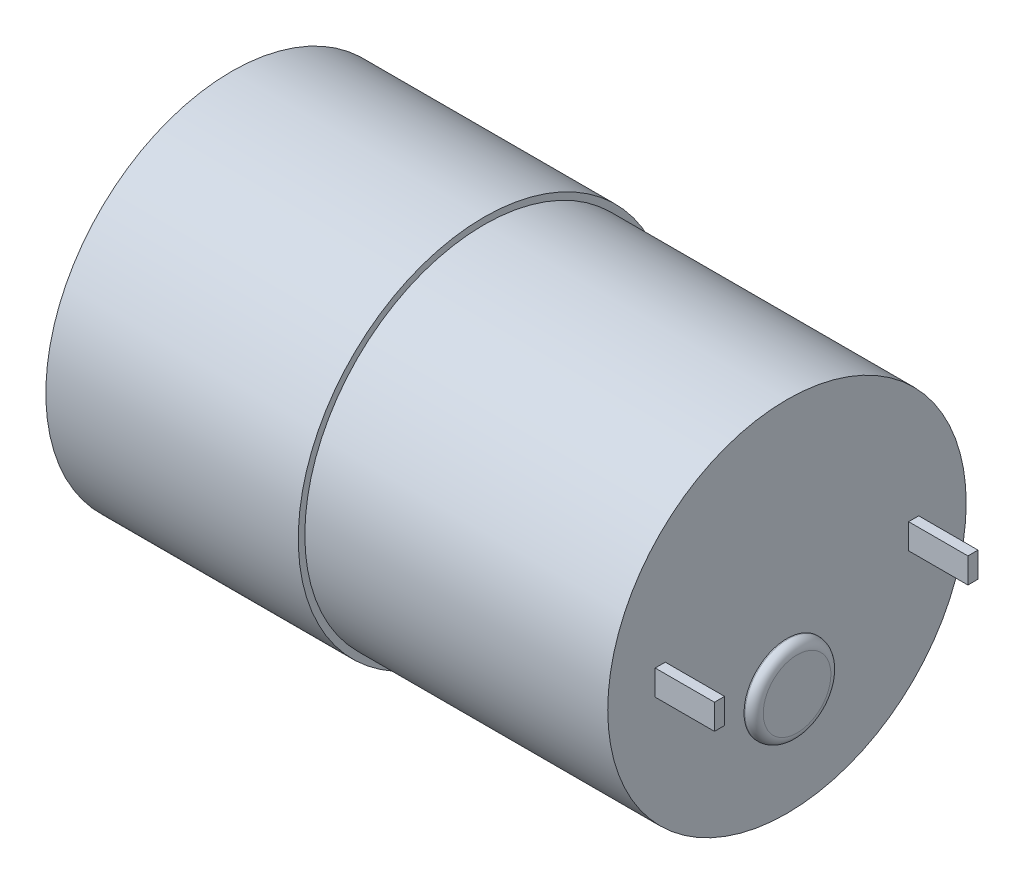
ISO-10303-21;
HEADER;
FILE_DESCRIPTION(('STEP AP214'),'2;1');
FILE_NAME('part.step','',(''),(''),'','','');
FILE_SCHEMA(('AUTOMOTIVE_DESIGN { 1 0 10303 214 1 1 1 1 }'));
ENDSEC;
DATA;
#1=APPLICATION_CONTEXT('core data for automotive mechanical design processes');
#2=APPLICATION_PROTOCOL_DEFINITION('international standard','automotive_design',2000,#1);
#3=PRODUCT_CONTEXT('',#1,'mechanical');
#4=PRODUCT('Part','Part','',(#3));
#5=PRODUCT_RELATED_PRODUCT_CATEGORY('part','',(#4));
#6=PRODUCT_DEFINITION_FORMATION('','',#4);
#7=PRODUCT_DEFINITION_CONTEXT('part definition',#1,'design');
#8=PRODUCT_DEFINITION('design','',#6,#7);
#9=PRODUCT_DEFINITION_SHAPE('','',#8);
#10=(LENGTH_UNIT() NAMED_UNIT(*) SI_UNIT(.MILLI.,.METRE.));
#11=(NAMED_UNIT(*) PLANE_ANGLE_UNIT() SI_UNIT($,.RADIAN.));
#12=(NAMED_UNIT(*) SI_UNIT($,.STERADIAN.) SOLID_ANGLE_UNIT());
#13=UNCERTAINTY_MEASURE_WITH_UNIT(LENGTH_MEASURE(1.E-05),#10,'distance_accuracy_value','');
#14=(GEOMETRIC_REPRESENTATION_CONTEXT(3) GLOBAL_UNCERTAINTY_ASSIGNED_CONTEXT((#13)) GLOBAL_UNIT_ASSIGNED_CONTEXT((#10,
#11,#12)) REPRESENTATION_CONTEXT('',''));
#15=CARTESIAN_POINT('',(0.,0.,0.));
#16=DIRECTION('',(0.,0.,1.));
#17=DIRECTION('',(1.,0.,0.));
#18=AXIS2_PLACEMENT_3D('',#15,#16,#17);
#19=CARTESIAN_POINT('',(-20.0340698562117,-7.,0.));
#20=DIRECTION('',(-1.,0.,0.));
#21=DIRECTION('',(0.,0.,1.));
#22=AXIS2_PLACEMENT_3D('',#19,#20,#21);
#23=CONICAL_SURFACE('',#22,0.,0.879418555966087);
#24=CARTESIAN_POINT('',(-25.,-7.,0.));
#25=DIRECTION('',(1.,0.,0.));
#26=DIRECTION('',(0.,0.,-1.));
#27=AXIS2_PLACEMENT_3D('',#24,#25,#26);
#28=CIRCLE('',#27,6.);
#29=CARTESIAN_POINT('',(-25.,-7.,-6.));
#30=VERTEX_POINT('',#29);
#31=EDGE_CURVE('E103',#30,#30,#28,.T.);
#32=ORIENTED_EDGE('',*,*,#31,.T.);
#33=EDGE_LOOP('',(#32));
#34=FACE_BOUND('',#33,.T.);
#35=CARTESIAN_POINT('',(-20.0340698562117,-7.,0.));
#36=VERTEX_POINT('',#35);
#37=VERTEX_LOOP('',#36);
#38=FACE_BOUND('',#37,.T.);
#39=ADVANCED_FACE('F62',(#34,#38),#23,.T.);
#40=CARTESIAN_POINT('',(30.1,-7.,0.));
#41=DIRECTION('',(1.,0.,0.));
#42=DIRECTION('',(0.,0.,-1.));
#43=AXIS2_PLACEMENT_3D('',#40,#41,#42);
#44=CYLINDRICAL_SURFACE('',#43,6.);
#45=CARTESIAN_POINT('',(-29.85,-7.,0.));
#46=DIRECTION('',(-1.,0.,0.));
#47=DIRECTION('',(0.,0.,1.));
#48=AXIS2_PLACEMENT_3D('',#45,#46,#47);
#49=CIRCLE('',#48,6.);
#50=CARTESIAN_POINT('',(-29.85,-7.,6.));
#51=VERTEX_POINT('',#50);
#52=EDGE_CURVE('E69',#51,#51,#49,.F.);
#53=ORIENTED_EDGE('',*,*,#52,.T.);
#54=EDGE_LOOP('',(#53));
#55=FACE_BOUND('',#54,.T.);
#56=ORIENTED_EDGE('',*,*,#31,.F.);
#57=EDGE_LOOP('',(#56));
#58=FACE_BOUND('',#57,.T.);
#59=ADVANCED_FACE('F73',(#55,#58),#44,.T.);
#60=CARTESIAN_POINT('',(-31.5,-1.,0.));
#61=DIRECTION('',(-1.,0.,0.));
#62=DIRECTION('',(0.,0.,1.));
#63=AXIS2_PLACEMENT_3D('',#60,#61,#62);
#64=PLANE('',#63);
#65=CARTESIAN_POINT('',(-31.5,-7.,0.));
#66=DIRECTION('',(-1.,0.,0.));
#67=DIRECTION('',(0.,0.,1.));
#68=AXIS2_PLACEMENT_3D('',#65,#66,#67);
#69=CIRCLE('',#68,4.34999999999999);
#70=CARTESIAN_POINT('',(-31.5,-7.,4.34999999999999));
#71=VERTEX_POINT('',#70);
#72=EDGE_CURVE('E14',#71,#71,#69,.T.);
#73=ORIENTED_EDGE('',*,*,#72,.T.);
#74=EDGE_LOOP('',(#73));
#75=FACE_BOUND('',#74,.T.);
#76=CARTESIAN_POINT('',(-31.5,-7.,0.));
#77=DIRECTION('',(1.,0.,0.));
#78=DIRECTION('',(0.,0.,-1.));
#79=AXIS2_PLACEMENT_3D('',#76,#77,#78);
#80=CIRCLE('',#79,3.);
#81=CARTESIAN_POINT('',(-31.5,-7.,-3.));
#82=VERTEX_POINT('',#81);
#83=EDGE_CURVE('E100',#82,#82,#80,.T.);
#84=ORIENTED_EDGE('',*,*,#83,.T.);
#85=EDGE_LOOP('',(#84));
#86=FACE_BOUND('',#85,.T.);
#87=ADVANCED_FACE('F78',(#75,#86),#64,.T.);
#88=CARTESIAN_POINT('',(30.1,-7.,0.));
#89=DIRECTION('',(1.,0.,0.));
#90=DIRECTION('',(0.,0.,-1.));
#91=AXIS2_PLACEMENT_3D('',#88,#89,#90);
#92=CYLINDRICAL_SURFACE('',#91,3.);
#93=CARTESIAN_POINT('',(-26.5,-7.,0.));
#94=DIRECTION('',(1.,0.,0.));
#95=DIRECTION('',(0.,0.,-1.));
#96=AXIS2_PLACEMENT_3D('',#93,#94,#95);
#97=CIRCLE('',#96,3.);
#98=CARTESIAN_POINT('',(-26.5,-7.,-3.));
#99=VERTEX_POINT('',#98);
#100=EDGE_CURVE('E99',#99,#99,#97,.T.);
#101=ORIENTED_EDGE('',*,*,#100,.T.);
#102=EDGE_LOOP('',(#101));
#103=FACE_BOUND('',#102,.T.);
#104=ORIENTED_EDGE('',*,*,#83,.F.);
#105=EDGE_LOOP('',(#104));
#106=FACE_BOUND('',#105,.T.);
#107=ADVANCED_FACE('F85',(#103,#106),#92,.F.);
#108=CARTESIAN_POINT('',(-26.5,-4.,0.));
#109=DIRECTION('',(-1.,0.,0.));
#110=DIRECTION('',(0.,0.,1.));
#111=AXIS2_PLACEMENT_3D('',#108,#109,#110);
#112=PLANE('',#111);
#113=ORIENTED_EDGE('',*,*,#100,.F.);
#114=EDGE_LOOP('',(#113));
#115=FACE_BOUND('',#114,.T.);
#116=ADVANCED_FACE('F89',(#115),#112,.T.);
#117=CARTESIAN_POINT('',(-29.85,-7.,0.));
#118=DIRECTION('',(1.,0.,0.));
#119=DIRECTION('',(0.,0.,-1.));
#120=AXIS2_PLACEMENT_3D('',#117,#118,#119);
#121=CONICAL_SURFACE('',#120,6.,0.78539816339745);
#122=ORIENTED_EDGE('',*,*,#72,.F.);
#123=EDGE_LOOP('',(#122));
#124=FACE_BOUND('',#123,.T.);
#125=ORIENTED_EDGE('',*,*,#52,.F.);
#126=EDGE_LOOP('',(#125));
#127=FACE_BOUND('',#126,.T.);
#128=ADVANCED_FACE('F64',(#124,#127),#121,.T.);
#129=CLOSED_SHELL('',(#39,#59,#87,#107,#116,#128));
#130=MANIFOLD_SOLID_BREP('B2',#129);
#131=CARTESIAN_POINT('',(30.,0.,0.));
#132=DIRECTION('',(-1.,0.,0.));
#133=DIRECTION('',(0.,-1.,0.));
#134=AXIS2_PLACEMENT_3D('',#131,#132,#133);
#135=PLANE('',#134);
#136=DIRECTION('',(0.,-1.,0.));
#137=VECTOR('',#136,1.);
#138=CARTESIAN_POINT('',(30.,1.25,-12.05));
#139=LINE('',#138,#137);
#140=CARTESIAN_POINT('',(30.,1.25,-12.05));
#141=VERTEX_POINT('',#140);
#142=CARTESIAN_POINT('',(30.,-1.25,-12.05));
#143=VERTEX_POINT('',#142);
#144=EDGE_CURVE('E292',#141,#143,#139,.T.);
#145=ORIENTED_EDGE('',*,*,#144,.F.);
#146=DIRECTION('',(0.,0.,1.));
#147=VECTOR('',#146,1.);
#148=CARTESIAN_POINT('',(30.,1.25,-12.05));
#149=LINE('',#148,#147);
#150=CARTESIAN_POINT('',(30.,1.25,-13.05));
#151=VERTEX_POINT('',#150);
#152=EDGE_CURVE('E305',#151,#141,#149,.T.);
#153=ORIENTED_EDGE('',*,*,#152,.F.);
#154=DIRECTION('',(0.,1.,0.));
#155=VECTOR('',#154,1.);
#156=CARTESIAN_POINT('',(30.,1.25,-13.05));
#157=LINE('',#156,#155);
#158=CARTESIAN_POINT('',(30.,-1.25,-13.05));
#159=VERTEX_POINT('',#158);
#160=EDGE_CURVE('E314',#159,#151,#157,.T.);
#161=ORIENTED_EDGE('',*,*,#160,.F.);
#162=DIRECTION('',(0.,0.,-1.));
#163=VECTOR('',#162,1.);
#164=CARTESIAN_POINT('',(30.,-1.25,-12.05));
#165=LINE('',#164,#163);
#166=EDGE_CURVE('E295',#143,#159,#165,.T.);
#167=ORIENTED_EDGE('',*,*,#166,.F.);
#168=EDGE_LOOP('',(#145,#153,#161,#167));
#169=FACE_BOUND('',#168,.T.);
#170=CARTESIAN_POINT('',(30.,-7.,0.));
#171=DIRECTION('',(-1.,0.,0.));
#172=DIRECTION('',(0.,-1.,0.));
#173=AXIS2_PLACEMENT_3D('',#170,#171,#172);
#174=CIRCLE('',#173,4.25);
#175=CARTESIAN_POINT('',(30.,-11.25,0.));
#176=VERTEX_POINT('',#175);
#177=EDGE_CURVE('E455',#176,#176,#174,.F.);
#178=ORIENTED_EDGE('',*,*,#177,.F.);
#179=EDGE_LOOP('',(#178));
#180=FACE_BOUND('',#179,.T.);
#181=CARTESIAN_POINT('',(30.,0.,0.));
#182=DIRECTION('',(-1.,0.,0.));
#183=DIRECTION('',(0.,-1.,0.));
#184=AXIS2_PLACEMENT_3D('',#181,#182,#183);
#185=CIRCLE('',#184,17.75);
#186=CARTESIAN_POINT('',(30.,-17.75,0.));
#187=VERTEX_POINT('',#186);
#188=EDGE_CURVE('E458',#187,#187,#185,.T.);
#189=ORIENTED_EDGE('',*,*,#188,.F.);
#190=EDGE_LOOP('',(#189));
#191=FACE_BOUND('',#190,.T.);
#192=DIRECTION('',(0.,-1.,0.));
#193=VECTOR('',#192,1.);
#194=CARTESIAN_POINT('',(30.,1.25,13.05));
#195=LINE('',#194,#193);
#196=CARTESIAN_POINT('',(30.,1.25,13.05));
#197=VERTEX_POINT('',#196);
#198=CARTESIAN_POINT('',(30.,-1.25,13.05));
#199=VERTEX_POINT('',#198);
#200=EDGE_CURVE('E291',#197,#199,#195,.T.);
#201=ORIENTED_EDGE('',*,*,#200,.F.);
#202=DIRECTION('',(0.,0.,1.));
#203=VECTOR('',#202,1.);
#204=CARTESIAN_POINT('',(30.,1.25,13.05));
#205=LINE('',#204,#203);
#206=CARTESIAN_POINT('',(30.,1.25,12.05));
#207=VERTEX_POINT('',#206);
#208=EDGE_CURVE('E288',#207,#197,#205,.T.);
#209=ORIENTED_EDGE('',*,*,#208,.F.);
#210=DIRECTION('',(0.,1.,0.));
#211=VECTOR('',#210,1.);
#212=CARTESIAN_POINT('',(30.,1.25,12.05));
#213=LINE('',#212,#211);
#214=CARTESIAN_POINT('',(30.,-1.25,12.05));
#215=VERTEX_POINT('',#214);
#216=EDGE_CURVE('E175',#215,#207,#213,.T.);
#217=ORIENTED_EDGE('',*,*,#216,.F.);
#218=DIRECTION('',(0.,0.,-1.));
#219=VECTOR('',#218,1.);
#220=CARTESIAN_POINT('',(30.,-1.25,13.05));
#221=LINE('',#220,#219);
#222=EDGE_CURVE('E170',#199,#215,#221,.T.);
#223=ORIENTED_EDGE('',*,*,#222,.F.);
#224=EDGE_LOOP('',(#201,#209,#217,#223));
#225=FACE_BOUND('',#224,.T.);
#226=ADVANCED_FACE('F155',(#169,#180,#191,#225),#135,.F.);
#227=CARTESIAN_POINT('',(-25.,18.4,0.));
#228=DIRECTION('',(1.,0.,0.));
#229=DIRECTION('',(0.,1.,0.));
#230=AXIS2_PLACEMENT_3D('',#227,#228,#229);
#231=PLANE('',#230);
#232=CARTESIAN_POINT('',(-25.,0.,-15.5));
#233=DIRECTION('',(-1.,0.,0.));
#234=DIRECTION('',(0.,0.,1.));
#235=AXIS2_PLACEMENT_3D('',#232,#233,#234);
#236=CIRCLE('',#235,1.24999999999999);
#237=CARTESIAN_POINT('',(-25.,0.,-14.25));
#238=VERTEX_POINT('',#237);
#239=EDGE_CURVE('E548',#238,#238,#236,.T.);
#240=ORIENTED_EDGE('',*,*,#239,.F.);
#241=EDGE_LOOP('',(#240));
#242=FACE_BOUND('',#241,.T.);
#243=CARTESIAN_POINT('',(-25.,13.4233937586588,-7.75));
#244=DIRECTION('',(-1.,0.,0.));
#245=DIRECTION('',(0.,0.,1.));
#246=AXIS2_PLACEMENT_3D('',#243,#244,#245);
#247=CIRCLE('',#246,1.24999999999999);
#248=CARTESIAN_POINT('',(-25.,13.4233937586588,-6.50000000000001));
#249=VERTEX_POINT('',#248);
#250=EDGE_CURVE('E560',#249,#249,#247,.T.);
#251=ORIENTED_EDGE('',*,*,#250,.F.);
#252=EDGE_LOOP('',(#251));
#253=FACE_BOUND('',#252,.T.);
#254=CARTESIAN_POINT('',(-25.,15.5,0.));
#255=DIRECTION('',(-1.,0.,0.));
#256=DIRECTION('',(0.,0.,1.));
#257=AXIS2_PLACEMENT_3D('',#254,#255,#256);
#258=CIRCLE('',#257,1.24999999999999);
#259=CARTESIAN_POINT('',(-25.,15.5,1.24999999999999));
#260=VERTEX_POINT('',#259);
#261=EDGE_CURVE('E566',#260,#260,#258,.T.);
#262=ORIENTED_EDGE('',*,*,#261,.F.);
#263=EDGE_LOOP('',(#262));
#264=FACE_BOUND('',#263,.T.);
#265=CARTESIAN_POINT('',(-25.,13.4233937586598,7.75000000000056));
#266=DIRECTION('',(-1.,0.,0.));
#267=DIRECTION('',(0.,0.,1.));
#268=AXIS2_PLACEMENT_3D('',#265,#266,#267);
#269=CIRCLE('',#268,1.24999999999999);
#270=CARTESIAN_POINT('',(-25.,13.4233937586598,9.00000000000055));
#271=VERTEX_POINT('',#270);
#272=EDGE_CURVE('E572',#271,#271,#269,.T.);
#273=ORIENTED_EDGE('',*,*,#272,.F.);
#274=EDGE_LOOP('',(#273));
#275=FACE_BOUND('',#274,.T.);
#276=CARTESIAN_POINT('',(-25.,9.74165293402677E-13,15.5000000000006));
#277=DIRECTION('',(-1.,0.,0.));
#278=DIRECTION('',(0.,0.,1.));
#279=AXIS2_PLACEMENT_3D('',#276,#277,#278);
#280=CIRCLE('',#279,1.24999999999999);
#281=CARTESIAN_POINT('',(-25.,9.74165293402677E-13,16.7500000000006));
#282=VERTEX_POINT('',#281);
#283=EDGE_CURVE('E578',#282,#282,#280,.T.);
#284=ORIENTED_EDGE('',*,*,#283,.F.);
#285=EDGE_LOOP('',(#284));
#286=FACE_BOUND('',#285,.T.);
#287=CARTESIAN_POINT('',(-25.,-7.74999999999943,13.4233937586598));
#288=DIRECTION('',(-1.,0.,0.));
#289=DIRECTION('',(0.,0.,1.));
#290=AXIS2_PLACEMENT_3D('',#287,#288,#289);
#291=CIRCLE('',#290,1.24999999999999);
#292=CARTESIAN_POINT('',(-25.,-7.74999999999943,14.6733937586598));
#293=VERTEX_POINT('',#292);
#294=EDGE_CURVE('E584',#293,#293,#291,.T.);
#295=ORIENTED_EDGE('',*,*,#294,.F.);
#296=EDGE_LOOP('',(#295));
#297=FACE_BOUND('',#296,.T.);
#298=CARTESIAN_POINT('',(-25.,-13.4233937586588,7.75000000000113));
#299=DIRECTION('',(-1.,0.,0.));
#300=DIRECTION('',(0.,0.,1.));
#301=AXIS2_PLACEMENT_3D('',#298,#299,#300);
#302=CIRCLE('',#301,1.24999999999999);
#303=CARTESIAN_POINT('',(-25.,-13.4233937586588,9.00000000000112));
#304=VERTEX_POINT('',#303);
#305=EDGE_CURVE('E590',#304,#304,#302,.T.);
#306=ORIENTED_EDGE('',*,*,#305,.F.);
#307=EDGE_LOOP('',(#306));
#308=FACE_BOUND('',#307,.T.);
#309=CARTESIAN_POINT('',(-25.,-13.4233937586588,-7.74999999999887));
#310=DIRECTION('',(-1.,0.,0.));
#311=DIRECTION('',(0.,0.,1.));
#312=AXIS2_PLACEMENT_3D('',#309,#310,#311);
#313=CIRCLE('',#312,1.24999999999999);
#314=CARTESIAN_POINT('',(-25.,-13.4233937586588,-6.49999999999888));
#315=VERTEX_POINT('',#314);
#316=EDGE_CURVE('E596',#315,#315,#313,.T.);
#317=ORIENTED_EDGE('',*,*,#316,.F.);
#318=EDGE_LOOP('',(#317));
#319=FACE_BOUND('',#318,.T.);
#320=CARTESIAN_POINT('',(-25.,-7.75000000000058,-13.4233937586578));
#321=DIRECTION('',(-1.,0.,0.));
#322=DIRECTION('',(0.,0.,1.));
#323=AXIS2_PLACEMENT_3D('',#320,#321,#322);
#324=CIRCLE('',#323,1.24999999999999);
#325=CARTESIAN_POINT('',(-25.,-7.75000000000058,-12.1733937586578));
#326=VERTEX_POINT('',#325);
#327=EDGE_CURVE('E602',#326,#326,#324,.T.);
#328=ORIENTED_EDGE('',*,*,#327,.F.);
#329=EDGE_LOOP('',(#328));
#330=FACE_BOUND('',#329,.T.);
#331=CARTESIAN_POINT('',(-25.,0.,0.));
#332=DIRECTION('',(-1.,0.,0.));
#333=DIRECTION('',(0.,-1.,0.));
#334=AXIS2_PLACEMENT_3D('',#331,#332,#333);
#335=CIRCLE('',#334,18.4);
#336=CARTESIAN_POINT('',(-25.,-18.4,0.));
#337=VERTEX_POINT('',#336);
#338=EDGE_CURVE('E608',#337,#337,#335,.T.);
#339=ORIENTED_EDGE('',*,*,#338,.T.);
#340=EDGE_LOOP('',(#339));
#341=FACE_BOUND('',#340,.T.);
#342=CARTESIAN_POINT('',(-25.,-7.,0.));
#343=DIRECTION('',(1.,0.,0.));
#344=DIRECTION('',(0.,1.,0.));
#345=AXIS2_PLACEMENT_3D('',#342,#343,#344);
#346=CIRCLE('',#345,8.58);
#347=CARTESIAN_POINT('',(-25.,-7.,-8.58));
#348=VERTEX_POINT('',#347);
#349=CARTESIAN_POINT('',(-25.,-7.,8.58));
#350=VERTEX_POINT('',#349);
#351=EDGE_CURVE('E530',#348,#350,#346,.T.);
#352=ORIENTED_EDGE('',*,*,#351,.F.);
#353=CARTESIAN_POINT('',(-25.,-7.,-9.68516907441476));
#354=CARTESIAN_POINT('',(-25.,-7.98776927571753,-8.65929790725998));
#355=CARTESIAN_POINT('',(-25.,-7.,-8.58));
#356=B_SPLINE_CURVE_WITH_KNOTS('',2,(#353,#354,#355),.UNSPECIFIED.,.F.,.F.,(3,3),(0.,1.),.UNSPECIFIED.);
#357=CARTESIAN_POINT('',(-25.,-7.,-9.68516907441475));
#358=VERTEX_POINT('',#357);
#359=EDGE_CURVE('E330',#358,#348,#356,.T.);
#360=ORIENTED_EDGE('',*,*,#359,.F.);
#361=CARTESIAN_POINT('',(-25.,0.,0.));
#362=DIRECTION('',(1.,0.,0.));
#363=DIRECTION('',(0.,1.,0.));
#364=AXIS2_PLACEMENT_3D('',#361,#362,#363);
#365=CIRCLE('',#364,11.95);
#366=CARTESIAN_POINT('',(-25.,-7.,9.68516907441475));
#367=VERTEX_POINT('',#366);
#368=EDGE_CURVE('E338',#358,#367,#365,.T.);
#369=ORIENTED_EDGE('',*,*,#368,.T.);
#370=CARTESIAN_POINT('',(-25.,-7.,8.58));
#371=CARTESIAN_POINT('',(-25.,-7.98776927571753,8.65929790725999));
#372=CARTESIAN_POINT('',(-25.,-7.,9.68516907441476));
#373=B_SPLINE_CURVE_WITH_KNOTS('',2,(#370,#371,#372),.UNSPECIFIED.,.F.,.F.,(3,3),(0.,1.),.UNSPECIFIED.);
#374=EDGE_CURVE('E536',#350,#367,#373,.T.);
#375=ORIENTED_EDGE('',*,*,#374,.F.);
#376=EDGE_LOOP('',(#352,#360,#369,#375));
#377=FACE_BOUND('',#376,.T.);
#378=ADVANCED_FACE('F433',(#242,#253,#264,#275,#286,#297,#308,#319,#330,#341,#377),#231,.F.);
#379=CARTESIAN_POINT('',(-25.,0.,0.));
#380=DIRECTION('',(-1.,0.,0.));
#381=DIRECTION('',(0.,-1.,0.));
#382=AXIS2_PLACEMENT_3D('',#379,#380,#381);
#383=CYLINDRICAL_SURFACE('',#382,17.75);
#384=CARTESIAN_POINT('',(0.,0.,0.));
#385=DIRECTION('',(-1.,0.,0.));
#386=DIRECTION('',(0.,-1.,0.));
#387=AXIS2_PLACEMENT_3D('',#384,#385,#386);
#388=CIRCLE('',#387,17.75);
#389=CARTESIAN_POINT('',(0.,-17.75,0.));
#390=VERTEX_POINT('',#389);
#391=EDGE_CURVE('E614',#390,#390,#388,.T.);
#392=ORIENTED_EDGE('',*,*,#391,.F.);
#393=EDGE_LOOP('',(#392));
#394=FACE_BOUND('',#393,.T.);
#395=ORIENTED_EDGE('',*,*,#188,.T.);
#396=EDGE_LOOP('',(#395));
#397=FACE_BOUND('',#396,.T.);
#398=ADVANCED_FACE('F436',(#394,#397),#383,.T.);
#399=CARTESIAN_POINT('',(0.,17.75,0.));
#400=DIRECTION('',(-1.,0.,0.));
#401=DIRECTION('',(0.,-1.,0.));
#402=AXIS2_PLACEMENT_3D('',#399,#400,#401);
#403=PLANE('',#402);
#404=CARTESIAN_POINT('',(0.,0.,0.));
#405=DIRECTION('',(-1.,0.,0.));
#406=DIRECTION('',(0.,-1.,0.));
#407=AXIS2_PLACEMENT_3D('',#404,#405,#406);
#408=CIRCLE('',#407,18.4);
#409=CARTESIAN_POINT('',(0.,-18.4,0.));
#410=VERTEX_POINT('',#409);
#411=EDGE_CURVE('E611',#410,#410,#408,.T.);
#412=ORIENTED_EDGE('',*,*,#411,.F.);
#413=EDGE_LOOP('',(#412));
#414=FACE_BOUND('',#413,.T.);
#415=ORIENTED_EDGE('',*,*,#391,.T.);
#416=EDGE_LOOP('',(#415));
#417=FACE_BOUND('',#416,.T.);
#418=ADVANCED_FACE('F440',(#414,#417),#403,.F.);
#419=CARTESIAN_POINT('',(-25.,0.,0.));
#420=DIRECTION('',(-1.,0.,0.));
#421=DIRECTION('',(0.,-1.,0.));
#422=AXIS2_PLACEMENT_3D('',#419,#420,#421);
#423=CYLINDRICAL_SURFACE('',#422,18.4);
#424=ORIENTED_EDGE('',*,*,#338,.F.);
#425=EDGE_LOOP('',(#424));
#426=FACE_BOUND('',#425,.T.);
#427=ORIENTED_EDGE('',*,*,#411,.T.);
#428=EDGE_LOOP('',(#427));
#429=FACE_BOUND('',#428,.T.);
#430=ADVANCED_FACE('F431',(#426,#429),#423,.T.);
#431=CARTESIAN_POINT('',(31.,-7.,0.));
#432=DIRECTION('',(-1.,0.,0.));
#433=DIRECTION('',(0.,-1.,0.));
#434=AXIS2_PLACEMENT_3D('',#431,#432,#433);
#435=CYLINDRICAL_SURFACE('',#434,4.25);
#436=CARTESIAN_POINT('',(30.1,-7.,0.));
#437=DIRECTION('',(1.,0.,0.));
#438=DIRECTION('',(0.,1.,0.));
#439=AXIS2_PLACEMENT_3D('',#436,#437,#438);
#440=CIRCLE('',#439,4.25);
#441=CARTESIAN_POINT('',(30.1,-2.75,0.));
#442=VERTEX_POINT('',#441);
#443=EDGE_CURVE('E60',#442,#442,#440,.F.);
#444=ORIENTED_EDGE('',*,*,#443,.T.);
#445=EDGE_LOOP('',(#444));
#446=FACE_BOUND('',#445,.T.);
#447=ORIENTED_EDGE('',*,*,#177,.T.);
#448=EDGE_LOOP('',(#447));
#449=FACE_BOUND('',#448,.T.);
#450=ADVANCED_FACE('F427',(#446,#449),#435,.T.);
#451=CARTESIAN_POINT('',(31.,-7.,0.));
#452=DIRECTION('',(1.,0.,0.));
#453=DIRECTION('',(0.,1.,0.));
#454=AXIS2_PLACEMENT_3D('',#451,#452,#453);
#455=PLANE('',#454);
#456=CARTESIAN_POINT('',(31.,-7.,0.));
#457=DIRECTION('',(1.,0.,0.));
#458=DIRECTION('',(0.,1.,0.));
#459=AXIS2_PLACEMENT_3D('',#456,#457,#458);
#460=CIRCLE('',#459,3.35);
#461=CARTESIAN_POINT('',(31.,-3.65,0.));
#462=VERTEX_POINT('',#461);
#463=EDGE_CURVE('E163',#462,#462,#460,.T.);
#464=ORIENTED_EDGE('',*,*,#463,.T.);
#465=EDGE_LOOP('',(#464));
#466=FACE_BOUND('',#465,.T.);
#467=ADVANCED_FACE('F424',(#466),#455,.T.);
#468=CARTESIAN_POINT('',(30.1,-7.,0.));
#469=DIRECTION('',(1.,0.,0.));
#470=DIRECTION('',(0.,1.,0.));
#471=AXIS2_PLACEMENT_3D('',#468,#469,#470);
#472=TOROIDAL_SURFACE('',#471,3.35,0.9);
#473=ORIENTED_EDGE('',*,*,#443,.F.);
#474=EDGE_LOOP('',(#473));
#475=FACE_BOUND('',#474,.T.);
#476=ORIENTED_EDGE('',*,*,#463,.F.);
#477=EDGE_LOOP('',(#476));
#478=FACE_BOUND('',#477,.T.);
#479=ADVANCED_FACE('F157',(#475,#478),#472,.T.);
#480=CARTESIAN_POINT('',(-24.,-7.75000000000058,-13.4233937586578));
#481=DIRECTION('',(-1.,0.,0.));
#482=DIRECTION('',(0.,0.,1.));
#483=AXIS2_PLACEMENT_3D('',#480,#481,#482);
#484=CONICAL_SURFACE('',#483,1.25,1.02974425867665);
#485=CARTESIAN_POINT('',(-23.2489242262155,-7.75000000000058,-13.4233937586578));
#486=VERTEX_POINT('',#485);
#487=VERTEX_LOOP('',#486);
#488=FACE_BOUND('',#487,.T.);
#489=CARTESIAN_POINT('',(-24.,-7.75000000000058,-13.4233937586578));
#490=DIRECTION('',(-1.,0.,0.));
#491=DIRECTION('',(0.,0.,1.));
#492=AXIS2_PLACEMENT_3D('',#489,#490,#491);
#493=CIRCLE('',#492,1.25);
#494=CARTESIAN_POINT('',(-24.,-7.75000000000058,-12.1733937586578));
#495=VERTEX_POINT('',#494);
#496=EDGE_CURVE('E605',#495,#495,#493,.T.);
#497=ORIENTED_EDGE('',*,*,#496,.T.);
#498=EDGE_LOOP('',(#497));
#499=FACE_BOUND('',#498,.T.);
#500=ADVANCED_FACE('F419',(#488,#499),#484,.F.);
#501=CARTESIAN_POINT('',(-25.,-7.75000000000058,-13.4233937586578));
#502=DIRECTION('',(-1.,0.,0.));
#503=DIRECTION('',(0.,0.,1.));
#504=AXIS2_PLACEMENT_3D('',#501,#502,#503);
#505=CYLINDRICAL_SURFACE('',#504,1.24999999999999);
#506=ORIENTED_EDGE('',*,*,#496,.F.);
#507=EDGE_LOOP('',(#506));
#508=FACE_BOUND('',#507,.T.);
#509=ORIENTED_EDGE('',*,*,#327,.T.);
#510=EDGE_LOOP('',(#509));
#511=FACE_BOUND('',#510,.T.);
#512=ADVANCED_FACE('F415',(#508,#511),#505,.F.);
#513=CARTESIAN_POINT('',(-24.,-13.4233937586588,-7.74999999999887));
#514=DIRECTION('',(-1.,0.,0.));
#515=DIRECTION('',(0.,0.,1.));
#516=AXIS2_PLACEMENT_3D('',#513,#514,#515);
#517=CONICAL_SURFACE('',#516,1.25,1.02974425867665);
#518=CARTESIAN_POINT('',(-23.2489242262155,-13.4233937586588,-7.74999999999887));
#519=VERTEX_POINT('',#518);
#520=VERTEX_LOOP('',#519);
#521=FACE_BOUND('',#520,.T.);
#522=CARTESIAN_POINT('',(-24.,-13.4233937586588,-7.74999999999887));
#523=DIRECTION('',(-1.,0.,0.));
#524=DIRECTION('',(0.,0.,1.));
#525=AXIS2_PLACEMENT_3D('',#522,#523,#524);
#526=CIRCLE('',#525,1.25);
#527=CARTESIAN_POINT('',(-24.,-13.4233937586588,-6.49999999999887));
#528=VERTEX_POINT('',#527);
#529=EDGE_CURVE('E599',#528,#528,#526,.T.);
#530=ORIENTED_EDGE('',*,*,#529,.T.);
#531=EDGE_LOOP('',(#530));
#532=FACE_BOUND('',#531,.T.);
#533=ADVANCED_FACE('F411',(#521,#532),#517,.F.);
#534=CARTESIAN_POINT('',(-25.,-13.4233937586588,-7.74999999999887));
#535=DIRECTION('',(-1.,0.,0.));
#536=DIRECTION('',(0.,0.,1.));
#537=AXIS2_PLACEMENT_3D('',#534,#535,#536);
#538=CYLINDRICAL_SURFACE('',#537,1.24999999999999);
#539=ORIENTED_EDGE('',*,*,#529,.F.);
#540=EDGE_LOOP('',(#539));
#541=FACE_BOUND('',#540,.T.);
#542=ORIENTED_EDGE('',*,*,#316,.T.);
#543=EDGE_LOOP('',(#542));
#544=FACE_BOUND('',#543,.T.);
#545=ADVANCED_FACE('F407',(#541,#544),#538,.F.);
#546=CARTESIAN_POINT('',(-24.,-13.4233937586588,7.75000000000113));
#547=DIRECTION('',(-1.,0.,0.));
#548=DIRECTION('',(0.,0.,1.));
#549=AXIS2_PLACEMENT_3D('',#546,#547,#548);
#550=CONICAL_SURFACE('',#549,1.25,1.02974425867665);
#551=CARTESIAN_POINT('',(-23.2489242262155,-13.4233937586588,7.75000000000113));
#552=VERTEX_POINT('',#551);
#553=VERTEX_LOOP('',#552);
#554=FACE_BOUND('',#553,.T.);
#555=CARTESIAN_POINT('',(-24.,-13.4233937586588,7.75000000000113));
#556=DIRECTION('',(-1.,0.,0.));
#557=DIRECTION('',(0.,0.,1.));
#558=AXIS2_PLACEMENT_3D('',#555,#556,#557);
#559=CIRCLE('',#558,1.25);
#560=CARTESIAN_POINT('',(-24.,-13.4233937586588,9.00000000000113));
#561=VERTEX_POINT('',#560);
#562=EDGE_CURVE('E593',#561,#561,#559,.T.);
#563=ORIENTED_EDGE('',*,*,#562,.T.);
#564=EDGE_LOOP('',(#563));
#565=FACE_BOUND('',#564,.T.);
#566=ADVANCED_FACE('F403',(#554,#565),#550,.F.);
#567=CARTESIAN_POINT('',(-25.,-13.4233937586588,7.75000000000113));
#568=DIRECTION('',(-1.,0.,0.));
#569=DIRECTION('',(0.,0.,1.));
#570=AXIS2_PLACEMENT_3D('',#567,#568,#569);
#571=CYLINDRICAL_SURFACE('',#570,1.24999999999999);
#572=ORIENTED_EDGE('',*,*,#562,.F.);
#573=EDGE_LOOP('',(#572));
#574=FACE_BOUND('',#573,.T.);
#575=ORIENTED_EDGE('',*,*,#305,.T.);
#576=EDGE_LOOP('',(#575));
#577=FACE_BOUND('',#576,.T.);
#578=ADVANCED_FACE('F399',(#574,#577),#571,.F.);
#579=CARTESIAN_POINT('',(-24.,-7.74999999999943,13.4233937586598));
#580=DIRECTION('',(-1.,0.,0.));
#581=DIRECTION('',(0.,0.,1.));
#582=AXIS2_PLACEMENT_3D('',#579,#580,#581);
#583=CONICAL_SURFACE('',#582,1.25,1.02974425867665);
#584=CARTESIAN_POINT('',(-23.2489242262155,-7.74999999999943,13.4233937586598));
#585=VERTEX_POINT('',#584);
#586=VERTEX_LOOP('',#585);
#587=FACE_BOUND('',#586,.T.);
#588=CARTESIAN_POINT('',(-24.,-7.74999999999943,13.4233937586598));
#589=DIRECTION('',(-1.,0.,0.));
#590=DIRECTION('',(0.,0.,1.));
#591=AXIS2_PLACEMENT_3D('',#588,#589,#590);
#592=CIRCLE('',#591,1.25);
#593=CARTESIAN_POINT('',(-24.,-7.74999999999943,14.6733937586598));
#594=VERTEX_POINT('',#593);
#595=EDGE_CURVE('E587',#594,#594,#592,.T.);
#596=ORIENTED_EDGE('',*,*,#595,.T.);
#597=EDGE_LOOP('',(#596));
#598=FACE_BOUND('',#597,.T.);
#599=ADVANCED_FACE('F395',(#587,#598),#583,.F.);
#600=CARTESIAN_POINT('',(-25.,-7.74999999999943,13.4233937586598));
#601=DIRECTION('',(-1.,0.,0.));
#602=DIRECTION('',(0.,0.,1.));
#603=AXIS2_PLACEMENT_3D('',#600,#601,#602);
#604=CYLINDRICAL_SURFACE('',#603,1.24999999999999);
#605=ORIENTED_EDGE('',*,*,#595,.F.);
#606=EDGE_LOOP('',(#605));
#607=FACE_BOUND('',#606,.T.);
#608=ORIENTED_EDGE('',*,*,#294,.T.);
#609=EDGE_LOOP('',(#608));
#610=FACE_BOUND('',#609,.T.);
#611=ADVANCED_FACE('F391',(#607,#610),#604,.F.);
#612=CARTESIAN_POINT('',(-24.,9.74165293402677E-13,15.5000000000006));
#613=DIRECTION('',(-1.,0.,0.));
#614=DIRECTION('',(0.,0.,1.));
#615=AXIS2_PLACEMENT_3D('',#612,#613,#614);
#616=CONICAL_SURFACE('',#615,1.25,1.02974425867665);
#617=CARTESIAN_POINT('',(-23.2489242262155,9.73736403534391E-13,15.5000000000006));
#618=VERTEX_POINT('',#617);
#619=VERTEX_LOOP('',#618);
#620=FACE_BOUND('',#619,.T.);
#621=CARTESIAN_POINT('',(-24.,9.74165293402677E-13,15.5000000000006));
#622=DIRECTION('',(-1.,0.,0.));
#623=DIRECTION('',(0.,0.,1.));
#624=AXIS2_PLACEMENT_3D('',#621,#622,#623);
#625=CIRCLE('',#624,1.25);
#626=CARTESIAN_POINT('',(-24.,9.74165293402677E-13,16.7500000000006));
#627=VERTEX_POINT('',#626);
#628=EDGE_CURVE('E581',#627,#627,#625,.T.);
#629=ORIENTED_EDGE('',*,*,#628,.T.);
#630=EDGE_LOOP('',(#629));
#631=FACE_BOUND('',#630,.T.);
#632=ADVANCED_FACE('F387',(#620,#631),#616,.F.);
#633=CARTESIAN_POINT('',(-25.,9.74165293402677E-13,15.5000000000006));
#634=DIRECTION('',(-1.,0.,0.));
#635=DIRECTION('',(0.,0.,1.));
#636=AXIS2_PLACEMENT_3D('',#633,#634,#635);
#637=CYLINDRICAL_SURFACE('',#636,1.24999999999999);
#638=ORIENTED_EDGE('',*,*,#628,.F.);
#639=EDGE_LOOP('',(#638));
#640=FACE_BOUND('',#639,.T.);
#641=ORIENTED_EDGE('',*,*,#283,.T.);
#642=EDGE_LOOP('',(#641));
#643=FACE_BOUND('',#642,.T.);
#644=ADVANCED_FACE('F383',(#640,#643),#637,.F.);
#645=CARTESIAN_POINT('',(-24.,13.4233937586598,7.75000000000056));
#646=DIRECTION('',(-1.,0.,0.));
#647=DIRECTION('',(0.,0.,1.));
#648=AXIS2_PLACEMENT_3D('',#645,#646,#647);
#649=CONICAL_SURFACE('',#648,1.25,1.02974425867665);
#650=CARTESIAN_POINT('',(-23.2489242262155,13.4233937586598,7.75000000000056));
#651=VERTEX_POINT('',#650);
#652=VERTEX_LOOP('',#651);
#653=FACE_BOUND('',#652,.T.);
#654=CARTESIAN_POINT('',(-24.,13.4233937586598,7.75000000000056));
#655=DIRECTION('',(-1.,0.,0.));
#656=DIRECTION('',(0.,0.,1.));
#657=AXIS2_PLACEMENT_3D('',#654,#655,#656);
#658=CIRCLE('',#657,1.25);
#659=CARTESIAN_POINT('',(-24.,13.4233937586598,9.00000000000056));
#660=VERTEX_POINT('',#659);
#661=EDGE_CURVE('E575',#660,#660,#658,.T.);
#662=ORIENTED_EDGE('',*,*,#661,.T.);
#663=EDGE_LOOP('',(#662));
#664=FACE_BOUND('',#663,.T.);
#665=ADVANCED_FACE('F379',(#653,#664),#649,.F.);
#666=CARTESIAN_POINT('',(-25.,13.4233937586598,7.75000000000056));
#667=DIRECTION('',(-1.,0.,0.));
#668=DIRECTION('',(0.,0.,1.));
#669=AXIS2_PLACEMENT_3D('',#666,#667,#668);
#670=CYLINDRICAL_SURFACE('',#669,1.24999999999999);
#671=ORIENTED_EDGE('',*,*,#661,.F.);
#672=EDGE_LOOP('',(#671));
#673=FACE_BOUND('',#672,.T.);
#674=ORIENTED_EDGE('',*,*,#272,.T.);
#675=EDGE_LOOP('',(#674));
#676=FACE_BOUND('',#675,.T.);
#677=ADVANCED_FACE('F375',(#673,#676),#670,.F.);
#678=CARTESIAN_POINT('',(-24.,15.5,0.));
#679=DIRECTION('',(-1.,0.,0.));
#680=DIRECTION('',(0.,0.,1.));
#681=AXIS2_PLACEMENT_3D('',#678,#679,#680);
#682=CONICAL_SURFACE('',#681,1.25,1.02974425867665);
#683=CARTESIAN_POINT('',(-23.2489242262155,15.5,0.));
#684=VERTEX_POINT('',#683);
#685=VERTEX_LOOP('',#684);
#686=FACE_BOUND('',#685,.T.);
#687=CARTESIAN_POINT('',(-24.,15.5,0.));
#688=DIRECTION('',(-1.,0.,0.));
#689=DIRECTION('',(0.,0.,1.));
#690=AXIS2_PLACEMENT_3D('',#687,#688,#689);
#691=CIRCLE('',#690,1.25);
#692=CARTESIAN_POINT('',(-24.,15.5,1.25));
#693=VERTEX_POINT('',#692);
#694=EDGE_CURVE('E569',#693,#693,#691,.T.);
#695=ORIENTED_EDGE('',*,*,#694,.T.);
#696=EDGE_LOOP('',(#695));
#697=FACE_BOUND('',#696,.T.);
#698=ADVANCED_FACE('F371',(#686,#697),#682,.F.);
#699=CARTESIAN_POINT('',(-25.,15.5,0.));
#700=DIRECTION('',(-1.,0.,0.));
#701=DIRECTION('',(0.,0.,1.));
#702=AXIS2_PLACEMENT_3D('',#699,#700,#701);
#703=CYLINDRICAL_SURFACE('',#702,1.24999999999999);
#704=ORIENTED_EDGE('',*,*,#694,.F.);
#705=EDGE_LOOP('',(#704));
#706=FACE_BOUND('',#705,.T.);
#707=ORIENTED_EDGE('',*,*,#261,.T.);
#708=EDGE_LOOP('',(#707));
#709=FACE_BOUND('',#708,.T.);
#710=ADVANCED_FACE('F367',(#706,#709),#703,.F.);
#711=CARTESIAN_POINT('',(-24.,13.4233937586588,-7.75));
#712=DIRECTION('',(-1.,0.,0.));
#713=DIRECTION('',(0.,0.,1.));
#714=AXIS2_PLACEMENT_3D('',#711,#712,#713);
#715=CONICAL_SURFACE('',#714,1.25,1.02974425867665);
#716=CARTESIAN_POINT('',(-23.2489242262155,13.4233937586588,-7.75));
#717=VERTEX_POINT('',#716);
#718=VERTEX_LOOP('',#717);
#719=FACE_BOUND('',#718,.T.);
#720=CARTESIAN_POINT('',(-24.,13.4233937586588,-7.75));
#721=DIRECTION('',(-1.,0.,0.));
#722=DIRECTION('',(0.,0.,1.));
#723=AXIS2_PLACEMENT_3D('',#720,#721,#722);
#724=CIRCLE('',#723,1.25);
#725=CARTESIAN_POINT('',(-24.,13.4233937586588,-6.5));
#726=VERTEX_POINT('',#725);
#727=EDGE_CURVE('E563',#726,#726,#724,.T.);
#728=ORIENTED_EDGE('',*,*,#727,.T.);
#729=EDGE_LOOP('',(#728));
#730=FACE_BOUND('',#729,.T.);
#731=ADVANCED_FACE('F363',(#719,#730),#715,.F.);
#732=CARTESIAN_POINT('',(-25.,13.4233937586588,-7.75));
#733=DIRECTION('',(-1.,0.,0.));
#734=DIRECTION('',(0.,0.,1.));
#735=AXIS2_PLACEMENT_3D('',#732,#733,#734);
#736=CYLINDRICAL_SURFACE('',#735,1.24999999999999);
#737=ORIENTED_EDGE('',*,*,#727,.F.);
#738=EDGE_LOOP('',(#737));
#739=FACE_BOUND('',#738,.T.);
#740=ORIENTED_EDGE('',*,*,#250,.T.);
#741=EDGE_LOOP('',(#740));
#742=FACE_BOUND('',#741,.T.);
#743=ADVANCED_FACE('F359',(#739,#742),#736,.F.);
#744=CARTESIAN_POINT('',(-24.,0.,-15.5));
#745=DIRECTION('',(-1.,0.,0.));
#746=DIRECTION('',(0.,0.,1.));
#747=AXIS2_PLACEMENT_3D('',#744,#745,#746);
#748=CONICAL_SURFACE('',#747,1.25,1.02974425867665);
#749=CARTESIAN_POINT('',(-23.2489242262155,0.,-15.5));
#750=VERTEX_POINT('',#749);
#751=VERTEX_LOOP('',#750);
#752=FACE_BOUND('',#751,.T.);
#753=CARTESIAN_POINT('',(-24.,0.,-15.5));
#754=DIRECTION('',(-1.,0.,0.));
#755=DIRECTION('',(0.,0.,1.));
#756=AXIS2_PLACEMENT_3D('',#753,#754,#755);
#757=CIRCLE('',#756,1.25);
#758=CARTESIAN_POINT('',(-24.,0.,-14.25));
#759=VERTEX_POINT('',#758);
#760=EDGE_CURVE('E557',#759,#759,#757,.T.);
#761=ORIENTED_EDGE('',*,*,#760,.T.);
#762=EDGE_LOOP('',(#761));
#763=FACE_BOUND('',#762,.T.);
#764=ADVANCED_FACE('F355',(#752,#763),#748,.F.);
#765=CARTESIAN_POINT('',(-25.,0.,-15.5));
#766=DIRECTION('',(-1.,0.,0.));
#767=DIRECTION('',(0.,0.,1.));
#768=AXIS2_PLACEMENT_3D('',#765,#766,#767);
#769=CYLINDRICAL_SURFACE('',#768,1.24999999999999);
#770=ORIENTED_EDGE('',*,*,#760,.F.);
#771=EDGE_LOOP('',(#770));
#772=FACE_BOUND('',#771,.T.);
#773=ORIENTED_EDGE('',*,*,#239,.T.);
#774=EDGE_LOOP('',(#773));
#775=FACE_BOUND('',#774,.T.);
#776=ADVANCED_FACE('F349',(#772,#775),#769,.F.);
#777=CARTESIAN_POINT('',(-24.,-7.,-9.68516907441476));
#778=CARTESIAN_POINT('',(-24.,-7.98776927571753,-8.65929790725998));
#779=CARTESIAN_POINT('',(-24.,-7.,-8.58));
#780=B_SPLINE_CURVE_WITH_KNOTS('',2,(#777,#778,#779),.UNSPECIFIED.,.F.,.F.,(3,3),(0.,1.),.UNSPECIFIED.);
#781=DIRECTION('',(-1.,0.,0.));
#782=VECTOR('',#781,1.);
#783=SURFACE_OF_LINEAR_EXTRUSION('',#780,#782);
#784=ORIENTED_EDGE('',*,*,#359,.T.);
#785=DIRECTION('',(-1.,0.,0.));
#786=VECTOR('',#785,1.);
#787=CARTESIAN_POINT('',(-24.,-7.,-8.58));
#788=LINE('',#787,#786);
#789=CARTESIAN_POINT('',(-24.,-7.,-8.58));
#790=VERTEX_POINT('',#789);
#791=EDGE_CURVE('E526',#790,#348,#788,.T.);
#792=ORIENTED_EDGE('',*,*,#791,.F.);
#793=CARTESIAN_POINT('',(-24.,-7.,-9.68516907441475));
#794=VERTEX_POINT('',#793);
#795=EDGE_CURVE('E331',#794,#790,#780,.T.);
#796=ORIENTED_EDGE('',*,*,#795,.F.);
#797=DIRECTION('',(-1.,0.,0.));
#798=VECTOR('',#797,1.);
#799=CARTESIAN_POINT('',(-24.,-7.,-9.68516907441475));
#800=LINE('',#799,#798);
#801=EDGE_CURVE('E546',#794,#358,#800,.T.);
#802=ORIENTED_EDGE('',*,*,#801,.T.);
#803=EDGE_LOOP('',(#784,#792,#796,#802));
#804=FACE_BOUND('',#803,.T.);
#805=ADVANCED_FACE('F344',(#804),#783,.F.);
#806=CARTESIAN_POINT('',(-24.,0.,0.));
#807=DIRECTION('',(-1.,0.,0.));
#808=DIRECTION('',(0.,-1.,0.));
#809=AXIS2_PLACEMENT_3D('',#806,#807,#808);
#810=CYLINDRICAL_SURFACE('',#809,11.95);
#811=ORIENTED_EDGE('',*,*,#368,.F.);
#812=ORIENTED_EDGE('',*,*,#801,.F.);
#813=CARTESIAN_POINT('',(-24.,0.,0.));
#814=DIRECTION('',(1.,0.,0.));
#815=DIRECTION('',(0.,1.,0.));
#816=AXIS2_PLACEMENT_3D('',#813,#814,#815);
#817=CIRCLE('',#816,11.95);
#818=CARTESIAN_POINT('',(-24.,-7.,9.68516907441475));
#819=VERTEX_POINT('',#818);
#820=EDGE_CURVE('E521',#794,#819,#817,.T.);
#821=ORIENTED_EDGE('',*,*,#820,.T.);
#822=DIRECTION('',(-1.,0.,0.));
#823=VECTOR('',#822,1.);
#824=CARTESIAN_POINT('',(-24.,-7.,9.68516907441475));
#825=LINE('',#824,#823);
#826=EDGE_CURVE('E549',#819,#367,#825,.T.);
#827=ORIENTED_EDGE('',*,*,#826,.T.);
#828=EDGE_LOOP('',(#811,#812,#821,#827));
#829=FACE_BOUND('',#828,.T.);
#830=ADVANCED_FACE('F348',(#829),#810,.F.);
#831=CARTESIAN_POINT('',(-24.,-7.,8.58));
#832=CARTESIAN_POINT('',(-24.,-7.98776927571753,8.65929790725999));
#833=CARTESIAN_POINT('',(-24.,-7.,9.68516907441476));
#834=B_SPLINE_CURVE_WITH_KNOTS('',2,(#831,#832,#833),.UNSPECIFIED.,.F.,.F.,(3,3),(0.,1.),.UNSPECIFIED.);
#835=DIRECTION('',(-1.,0.,0.));
#836=VECTOR('',#835,1.);
#837=SURFACE_OF_LINEAR_EXTRUSION('',#834,#836);
#838=ORIENTED_EDGE('',*,*,#374,.T.);
#839=ORIENTED_EDGE('',*,*,#826,.F.);
#840=CARTESIAN_POINT('',(-24.,-7.,8.58));
#841=VERTEX_POINT('',#840);
#842=EDGE_CURVE('E515',#841,#819,#834,.T.);
#843=ORIENTED_EDGE('',*,*,#842,.F.);
#844=DIRECTION('',(-1.,0.,0.));
#845=VECTOR('',#844,1.);
#846=CARTESIAN_POINT('',(-24.,-7.,8.58));
#847=LINE('',#846,#845);
#848=EDGE_CURVE('E551',#841,#350,#847,.T.);
#849=ORIENTED_EDGE('',*,*,#848,.T.);
#850=EDGE_LOOP('',(#838,#839,#843,#849));
#851=FACE_BOUND('',#850,.T.);
#852=ADVANCED_FACE('F511',(#851),#837,.F.);
#853=CARTESIAN_POINT('',(-24.,-7.,0.));
#854=DIRECTION('',(-1.,0.,0.));
#855=DIRECTION('',(0.,-1.,0.));
#856=AXIS2_PLACEMENT_3D('',#853,#854,#855);
#857=CYLINDRICAL_SURFACE('',#856,8.58);
#858=ORIENTED_EDGE('',*,*,#351,.T.);
#859=ORIENTED_EDGE('',*,*,#848,.F.);
#860=CARTESIAN_POINT('',(-24.,-7.,0.));
#861=DIRECTION('',(1.,0.,0.));
#862=DIRECTION('',(0.,1.,0.));
#863=AXIS2_PLACEMENT_3D('',#860,#861,#862);
#864=CIRCLE('',#863,8.58);
#865=EDGE_CURVE('E337',#790,#841,#864,.T.);
#866=ORIENTED_EDGE('',*,*,#865,.F.);
#867=ORIENTED_EDGE('',*,*,#791,.T.);
#868=EDGE_LOOP('',(#858,#859,#866,#867));
#869=FACE_BOUND('',#868,.T.);
#870=ADVANCED_FACE('F351',(#869),#857,.T.);
#871=CARTESIAN_POINT('',(-24.,-7.49388463785877,-8.89594122223368));
#872=DIRECTION('',(1.,0.,0.));
#873=DIRECTION('',(0.,0.,-1.));
#874=AXIS2_PLACEMENT_3D('',#871,#872,#873);
#875=PLANE('',#874);
#876=ORIENTED_EDGE('',*,*,#795,.T.);
#877=ORIENTED_EDGE('',*,*,#865,.T.);
#878=ORIENTED_EDGE('',*,*,#842,.T.);
#879=ORIENTED_EDGE('',*,*,#820,.F.);
#880=EDGE_LOOP('',(#876,#877,#878,#879));
#881=FACE_BOUND('',#880,.T.);
#882=ADVANCED_FACE('F505',(#881),#875,.F.);
#883=CARTESIAN_POINT('',(35.87,1.25,-12.05));
#884=DIRECTION('',(0.,0.,-1.));
#885=DIRECTION('',(-1.,0.,0.));
#886=AXIS2_PLACEMENT_3D('',#883,#884,#885);
#887=PLANE('',#886);
#888=ORIENTED_EDGE('',*,*,#144,.T.);
#889=DIRECTION('',(-1.,0.,0.));
#890=VECTOR('',#889,1.);
#891=CARTESIAN_POINT('',(35.87,-1.25,-12.05));
#892=LINE('',#891,#890);
#893=CARTESIAN_POINT('',(35.87,-1.25,-12.05));
#894=VERTEX_POINT('',#893);
#895=EDGE_CURVE('E327',#894,#143,#892,.T.);
#896=ORIENTED_EDGE('',*,*,#895,.F.);
#897=DIRECTION('',(0.,-1.,0.));
#898=VECTOR('',#897,1.);
#899=CARTESIAN_POINT('',(35.87,1.25,-12.05));
#900=LINE('',#899,#898);
#901=CARTESIAN_POINT('',(35.87,1.25,-12.05));
#902=VERTEX_POINT('',#901);
#903=EDGE_CURVE('E301',#902,#894,#900,.T.);
#904=ORIENTED_EDGE('',*,*,#903,.F.);
#905=DIRECTION('',(-1.,0.,0.));
#906=VECTOR('',#905,1.);
#907=CARTESIAN_POINT('',(35.87,1.25,-12.05));
#908=LINE('',#907,#906);
#909=EDGE_CURVE('E310',#902,#141,#908,.T.);
#910=ORIENTED_EDGE('',*,*,#909,.T.);
#911=EDGE_LOOP('',(#888,#896,#904,#910));
#912=FACE_BOUND('',#911,.T.);
#913=ADVANCED_FACE('F501',(#912),#887,.F.);
#914=CARTESIAN_POINT('',(35.87,-1.25,-12.05));
#915=DIRECTION('',(0.,1.,0.));
#916=DIRECTION('',(-1.,0.,0.));
#917=AXIS2_PLACEMENT_3D('',#914,#915,#916);
#918=PLANE('',#917);
#919=ORIENTED_EDGE('',*,*,#166,.T.);
#920=DIRECTION('',(-1.,0.,0.));
#921=VECTOR('',#920,1.);
#922=CARTESIAN_POINT('',(35.87,-1.25,-13.05));
#923=LINE('',#922,#921);
#924=CARTESIAN_POINT('',(35.87,-1.25,-13.05));
#925=VERTEX_POINT('',#924);
#926=EDGE_CURVE('E324',#925,#159,#923,.T.);
#927=ORIENTED_EDGE('',*,*,#926,.F.);
#928=DIRECTION('',(0.,0.,-1.));
#929=VECTOR('',#928,1.);
#930=CARTESIAN_POINT('',(35.87,-1.25,-12.05));
#931=LINE('',#930,#929);
#932=EDGE_CURVE('E304',#894,#925,#931,.T.);
#933=ORIENTED_EDGE('',*,*,#932,.F.);
#934=ORIENTED_EDGE('',*,*,#895,.T.);
#935=EDGE_LOOP('',(#919,#927,#933,#934));
#936=FACE_BOUND('',#935,.T.);
#937=ADVANCED_FACE('F497',(#936),#918,.F.);
#938=CARTESIAN_POINT('',(35.87,1.25,-13.05));
#939=DIRECTION('',(0.,0.,1.));
#940=DIRECTION('',(1.,0.,0.));
#941=AXIS2_PLACEMENT_3D('',#938,#939,#940);
#942=PLANE('',#941);
#943=ORIENTED_EDGE('',*,*,#160,.T.);
#944=DIRECTION('',(-1.,0.,0.));
#945=VECTOR('',#944,1.);
#946=CARTESIAN_POINT('',(35.87,1.25,-13.05));
#947=LINE('',#946,#945);
#948=CARTESIAN_POINT('',(35.87,1.25,-13.05));
#949=VERTEX_POINT('',#948);
#950=EDGE_CURVE('E321',#949,#151,#947,.T.);
#951=ORIENTED_EDGE('',*,*,#950,.F.);
#952=DIRECTION('',(0.,1.,0.));
#953=VECTOR('',#952,1.);
#954=CARTESIAN_POINT('',(35.87,1.25,-13.05));
#955=LINE('',#954,#953);
#956=EDGE_CURVE('E307',#925,#949,#955,.T.);
#957=ORIENTED_EDGE('',*,*,#956,.F.);
#958=ORIENTED_EDGE('',*,*,#926,.T.);
#959=EDGE_LOOP('',(#943,#951,#957,#958));
#960=FACE_BOUND('',#959,.T.);
#961=ADVANCED_FACE('F493',(#960),#942,.F.);
#962=CARTESIAN_POINT('',(35.87,1.25,-12.05));
#963=DIRECTION('',(0.,-1.,0.));
#964=DIRECTION('',(0.,0.,-1.));
#965=AXIS2_PLACEMENT_3D('',#962,#963,#964);
#966=PLANE('',#965);
#967=ORIENTED_EDGE('',*,*,#152,.T.);
#968=ORIENTED_EDGE('',*,*,#909,.F.);
#969=DIRECTION('',(0.,0.,1.));
#970=VECTOR('',#969,1.);
#971=CARTESIAN_POINT('',(35.87,1.25,-12.05));
#972=LINE('',#971,#970);
#973=EDGE_CURVE('E309',#949,#902,#972,.T.);
#974=ORIENTED_EDGE('',*,*,#973,.F.);
#975=ORIENTED_EDGE('',*,*,#950,.T.);
#976=EDGE_LOOP('',(#967,#968,#974,#975));
#977=FACE_BOUND('',#976,.T.);
#978=ADVANCED_FACE('F489',(#977),#966,.F.);
#979=CARTESIAN_POINT('',(35.87,0.,0.));
#980=DIRECTION('',(1.,0.,0.));
#981=DIRECTION('',(0.,0.,-1.));
#982=AXIS2_PLACEMENT_3D('',#979,#980,#981);
#983=PLANE('',#982);
#984=ORIENTED_EDGE('',*,*,#903,.T.);
#985=ORIENTED_EDGE('',*,*,#932,.T.);
#986=ORIENTED_EDGE('',*,*,#956,.T.);
#987=ORIENTED_EDGE('',*,*,#973,.T.);
#988=EDGE_LOOP('',(#984,#985,#986,#987));
#989=FACE_BOUND('',#988,.T.);
#990=ADVANCED_FACE('F486',(#989),#983,.T.);
#991=CARTESIAN_POINT('',(35.87,1.25,13.05));
#992=DIRECTION('',(0.,0.,-1.));
#993=DIRECTION('',(-1.,0.,0.));
#994=AXIS2_PLACEMENT_3D('',#991,#992,#993);
#995=PLANE('',#994);
#996=ORIENTED_EDGE('',*,*,#200,.T.);
#997=DIRECTION('',(-1.,0.,0.));
#998=VECTOR('',#997,1.);
#999=CARTESIAN_POINT('',(35.87,-1.25,13.05));
#1000=LINE('',#999,#998);
#1001=CARTESIAN_POINT('',(35.87,-1.25,13.05));
#1002=VERTEX_POINT('',#1001);
#1003=EDGE_CURVE('E272',#1002,#199,#1000,.T.);
#1004=ORIENTED_EDGE('',*,*,#1003,.F.);
#1005=DIRECTION('',(0.,-1.,0.));
#1006=VECTOR('',#1005,1.);
#1007=CARTESIAN_POINT('',(35.87,1.25,13.05));
#1008=LINE('',#1007,#1006);
#1009=CARTESIAN_POINT('',(35.87,1.25,13.05));
#1010=VERTEX_POINT('',#1009);
#1011=EDGE_CURVE('E279',#1010,#1002,#1008,.T.);
#1012=ORIENTED_EDGE('',*,*,#1011,.F.);
#1013=DIRECTION('',(-1.,0.,0.));
#1014=VECTOR('',#1013,1.);
#1015=CARTESIAN_POINT('',(35.87,1.25,13.05));
#1016=LINE('',#1015,#1014);
#1017=EDGE_CURVE('E464',#1010,#197,#1016,.T.);
#1018=ORIENTED_EDGE('',*,*,#1017,.T.);
#1019=EDGE_LOOP('',(#996,#1004,#1012,#1018));
#1020=FACE_BOUND('',#1019,.T.);
#1021=ADVANCED_FACE('F290',(#1020),#995,.F.);
#1022=CARTESIAN_POINT('',(35.87,-1.25,13.05));
#1023=DIRECTION('',(0.,1.,0.));
#1024=DIRECTION('',(-1.,0.,0.));
#1025=AXIS2_PLACEMENT_3D('',#1022,#1023,#1024);
#1026=PLANE('',#1025);
#1027=ORIENTED_EDGE('',*,*,#222,.T.);
#1028=DIRECTION('',(-1.,0.,0.));
#1029=VECTOR('',#1028,1.);
#1030=CARTESIAN_POINT('',(35.87,-1.25,12.05));
#1031=LINE('',#1030,#1029);
#1032=CARTESIAN_POINT('',(35.87,-1.25,12.05));
#1033=VERTEX_POINT('',#1032);
#1034=EDGE_CURVE('E275',#1033,#215,#1031,.T.);
#1035=ORIENTED_EDGE('',*,*,#1034,.F.);
#1036=DIRECTION('',(0.,0.,-1.));
#1037=VECTOR('',#1036,1.);
#1038=CARTESIAN_POINT('',(35.87,-1.25,13.05));
#1039=LINE('',#1038,#1037);
#1040=EDGE_CURVE('E268',#1002,#1033,#1039,.T.);
#1041=ORIENTED_EDGE('',*,*,#1040,.F.);
#1042=ORIENTED_EDGE('',*,*,#1003,.T.);
#1043=EDGE_LOOP('',(#1027,#1035,#1041,#1042));
#1044=FACE_BOUND('',#1043,.T.);
#1045=ADVANCED_FACE('F270',(#1044),#1026,.F.);
#1046=CARTESIAN_POINT('',(35.87,1.25,12.05));
#1047=DIRECTION('',(0.,0.,1.));
#1048=DIRECTION('',(1.,0.,0.));
#1049=AXIS2_PLACEMENT_3D('',#1046,#1047,#1048);
#1050=PLANE('',#1049);
#1051=ORIENTED_EDGE('',*,*,#216,.T.);
#1052=DIRECTION('',(-1.,0.,0.));
#1053=VECTOR('',#1052,1.);
#1054=CARTESIAN_POINT('',(35.87,1.25,12.05));
#1055=LINE('',#1054,#1053);
#1056=CARTESIAN_POINT('',(35.87,1.25,12.05));
#1057=VERTEX_POINT('',#1056);
#1058=EDGE_CURVE('E297',#1057,#207,#1055,.T.);
#1059=ORIENTED_EDGE('',*,*,#1058,.F.);
#1060=DIRECTION('',(0.,1.,0.));
#1061=VECTOR('',#1060,1.);
#1062=CARTESIAN_POINT('',(35.87,1.25,12.05));
#1063=LINE('',#1062,#1061);
#1064=EDGE_CURVE('E278',#1033,#1057,#1063,.T.);
#1065=ORIENTED_EDGE('',*,*,#1064,.F.);
#1066=ORIENTED_EDGE('',*,*,#1034,.T.);
#1067=EDGE_LOOP('',(#1051,#1059,#1065,#1066));
#1068=FACE_BOUND('',#1067,.T.);
#1069=ADVANCED_FACE('F473',(#1068),#1050,.F.);
#1070=CARTESIAN_POINT('',(35.87,1.25,13.05));
#1071=DIRECTION('',(0.,-1.,0.));
#1072=DIRECTION('',(1.,0.,0.));
#1073=AXIS2_PLACEMENT_3D('',#1070,#1071,#1072);
#1074=PLANE('',#1073);
#1075=ORIENTED_EDGE('',*,*,#208,.T.);
#1076=ORIENTED_EDGE('',*,*,#1017,.F.);
#1077=DIRECTION('',(0.,0.,1.));
#1078=VECTOR('',#1077,1.);
#1079=CARTESIAN_POINT('',(35.87,1.25,13.05));
#1080=LINE('',#1079,#1078);
#1081=EDGE_CURVE('E284',#1057,#1010,#1080,.T.);
#1082=ORIENTED_EDGE('',*,*,#1081,.F.);
#1083=ORIENTED_EDGE('',*,*,#1058,.T.);
#1084=EDGE_LOOP('',(#1075,#1076,#1082,#1083));
#1085=FACE_BOUND('',#1084,.T.);
#1086=ADVANCED_FACE('F463',(#1085),#1074,.F.);
#1087=CARTESIAN_POINT('',(35.87,0.,0.));
#1088=DIRECTION('',(1.,0.,0.));
#1089=DIRECTION('',(0.,0.,-1.));
#1090=AXIS2_PLACEMENT_3D('',#1087,#1088,#1089);
#1091=PLANE('',#1090);
#1092=ORIENTED_EDGE('',*,*,#1011,.T.);
#1093=ORIENTED_EDGE('',*,*,#1040,.T.);
#1094=ORIENTED_EDGE('',*,*,#1064,.T.);
#1095=ORIENTED_EDGE('',*,*,#1081,.T.);
#1096=EDGE_LOOP('',(#1092,#1093,#1094,#1095));
#1097=FACE_BOUND('',#1096,.T.);
#1098=ADVANCED_FACE('F282',(#1097),#1091,.T.);
#1099=CLOSED_SHELL('',(#226,#378,#398,#418,#430,#450,#467,#479,#500,#512,#533,#545,#566,#578,
#599,#611,#632,#644,#665,#677,#698,#710,#731,#743,#764,#776,#805,#830,#852,#870,#882,#913,#937,
#961,#978,#990,#1021,#1045,#1069,#1086,#1098));
#1100=MANIFOLD_SOLID_BREP('B8',#1099);
#1101=ADVANCED_BREP_SHAPE_REPRESENTATION('',(#18,#130,#1100),#14);
#1102=SHAPE_DEFINITION_REPRESENTATION(#9,#1101);
ENDSEC;
END-ISO-10303-21;
